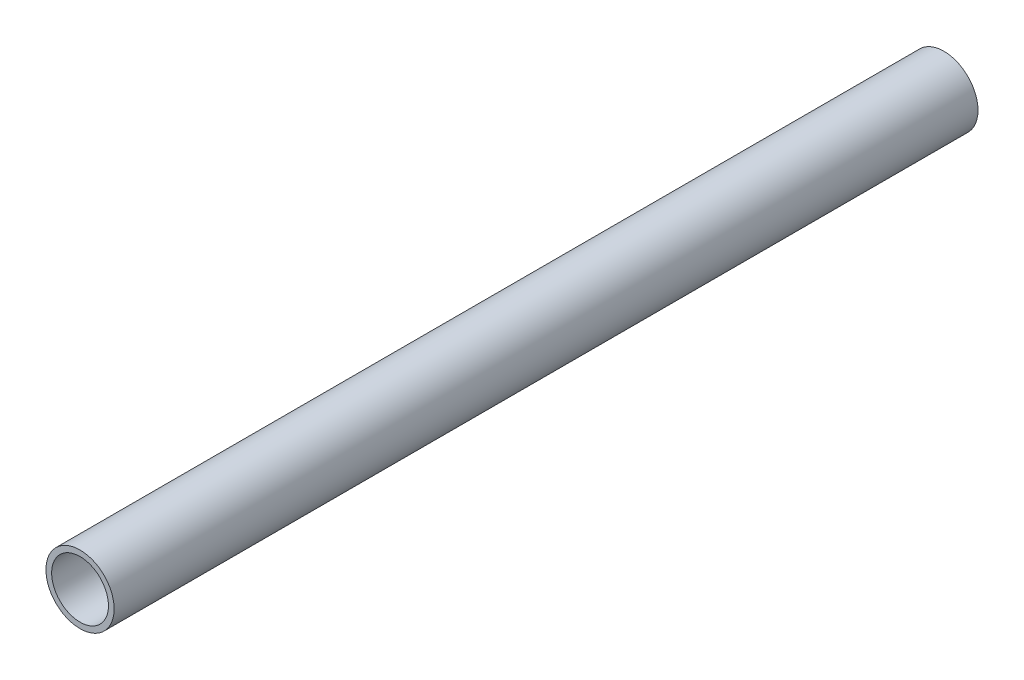
ISO-10303-21;
HEADER;
FILE_DESCRIPTION(('STEP AP214'),'2;1');
FILE_NAME('part.step','',(''),(''),'','','');
FILE_SCHEMA(('AUTOMOTIVE_DESIGN { 1 0 10303 214 1 1 1 1 }'));
ENDSEC;
DATA;
#1=APPLICATION_CONTEXT('core data for automotive mechanical design processes');
#2=APPLICATION_PROTOCOL_DEFINITION('international standard','automotive_design',2000,#1);
#3=PRODUCT_CONTEXT('',#1,'mechanical');
#4=PRODUCT('Part','Part','',(#3));
#5=PRODUCT_RELATED_PRODUCT_CATEGORY('part','',(#4));
#6=PRODUCT_DEFINITION_FORMATION('','',#4);
#7=PRODUCT_DEFINITION_CONTEXT('part definition',#1,'design');
#8=PRODUCT_DEFINITION('design','',#6,#7);
#9=PRODUCT_DEFINITION_SHAPE('','',#8);
#10=(LENGTH_UNIT() NAMED_UNIT(*) SI_UNIT(.MILLI.,.METRE.));
#11=(NAMED_UNIT(*) PLANE_ANGLE_UNIT() SI_UNIT($,.RADIAN.));
#12=(NAMED_UNIT(*) SI_UNIT($,.STERADIAN.) SOLID_ANGLE_UNIT());
#13=UNCERTAINTY_MEASURE_WITH_UNIT(LENGTH_MEASURE(1.E-05),#10,'distance_accuracy_value','');
#14=(GEOMETRIC_REPRESENTATION_CONTEXT(3) GLOBAL_UNCERTAINTY_ASSIGNED_CONTEXT((#13)) GLOBAL_UNIT_ASSIGNED_CONTEXT((#10,
#11,#12)) REPRESENTATION_CONTEXT('',''));
#15=CARTESIAN_POINT('',(0.,0.,0.));
#16=DIRECTION('',(0.,0.,1.));
#17=DIRECTION('',(1.,0.,0.));
#18=AXIS2_PLACEMENT_3D('',#15,#16,#17);
#19=CARTESIAN_POINT('',(0.,0.,37.9984));
#20=DIRECTION('',(0.,0.,1.));
#21=DIRECTION('',(1.,0.,0.));
#22=AXIS2_PLACEMENT_3D('',#19,#20,#21);
#23=PLANE('',#22);
#24=CARTESIAN_POINT('',(0.,0.,37.9984));
#25=DIRECTION('',(0.,0.,1.));
#26=DIRECTION('',(1.,0.,0.));
#27=AXIS2_PLACEMENT_3D('',#24,#25,#26);
#28=CIRCLE('',#27,1.5);
#29=CARTESIAN_POINT('',(1.5,0.,37.9984));
#30=VERTEX_POINT('',#29);
#31=EDGE_CURVE('E10',#30,#30,#28,.T.);
#32=ORIENTED_EDGE('',*,*,#31,.T.);
#33=EDGE_LOOP('',(#32));
#34=FACE_BOUND('',#33,.T.);
#35=CARTESIAN_POINT('',(0.,0.,37.9984));
#36=DIRECTION('',(0.,0.,1.));
#37=DIRECTION('',(1.,0.,0.));
#38=AXIS2_PLACEMENT_3D('',#35,#36,#37);
#39=CIRCLE('',#38,1.25);
#40=CARTESIAN_POINT('',(1.25,0.,37.9984));
#41=VERTEX_POINT('',#40);
#42=EDGE_CURVE('E48',#41,#41,#39,.T.);
#43=ORIENTED_EDGE('',*,*,#42,.F.);
#44=EDGE_LOOP('',(#43));
#45=FACE_BOUND('',#44,.T.);
#46=ADVANCED_FACE('F37',(#34,#45),#23,.T.);
#47=CARTESIAN_POINT('',(0.,0.,0.));
#48=DIRECTION('',(0.,0.,1.));
#49=DIRECTION('',(1.,0.,0.));
#50=AXIS2_PLACEMENT_3D('',#47,#48,#49);
#51=PLANE('',#50);
#52=CARTESIAN_POINT('',(0.,0.,0.));
#53=DIRECTION('',(0.,0.,1.));
#54=DIRECTION('',(1.,0.,0.));
#55=AXIS2_PLACEMENT_3D('',#52,#53,#54);
#56=CIRCLE('',#55,1.5);
#57=CARTESIAN_POINT('',(1.5,0.,0.));
#58=VERTEX_POINT('',#57);
#59=EDGE_CURVE('E41',#58,#58,#56,.T.);
#60=ORIENTED_EDGE('',*,*,#59,.F.);
#61=EDGE_LOOP('',(#60));
#62=FACE_BOUND('',#61,.T.);
#63=CARTESIAN_POINT('',(0.,0.,0.));
#64=DIRECTION('',(0.,0.,1.));
#65=DIRECTION('',(1.,0.,0.));
#66=AXIS2_PLACEMENT_3D('',#63,#64,#65);
#67=CIRCLE('',#66,1.25);
#68=CARTESIAN_POINT('',(1.25,0.,0.));
#69=VERTEX_POINT('',#68);
#70=EDGE_CURVE('E50',#69,#69,#67,.T.);
#71=ORIENTED_EDGE('',*,*,#70,.T.);
#72=EDGE_LOOP('',(#71));
#73=FACE_BOUND('',#72,.T.);
#74=ADVANCED_FACE('F60',(#62,#73),#51,.F.);
#75=CARTESIAN_POINT('',(0.,0.,37.9984));
#76=DIRECTION('',(0.,0.,-1.));
#77=DIRECTION('',(-1.,0.,0.));
#78=AXIS2_PLACEMENT_3D('',#75,#76,#77);
#79=CYLINDRICAL_SURFACE('',#78,1.5);
#80=ORIENTED_EDGE('',*,*,#31,.F.);
#81=EDGE_LOOP('',(#80));
#82=FACE_BOUND('',#81,.T.);
#83=ORIENTED_EDGE('',*,*,#59,.T.);
#84=EDGE_LOOP('',(#83));
#85=FACE_BOUND('',#84,.T.);
#86=ADVANCED_FACE('F39',(#82,#85),#79,.T.);
#87=CARTESIAN_POINT('',(0.,0.,37.9984));
#88=DIRECTION('',(0.,0.,-1.));
#89=DIRECTION('',(-1.,0.,0.));
#90=AXIS2_PLACEMENT_3D('',#87,#88,#89);
#91=CYLINDRICAL_SURFACE('',#90,1.25);
#92=ORIENTED_EDGE('',*,*,#42,.T.);
#93=EDGE_LOOP('',(#92));
#94=FACE_BOUND('',#93,.T.);
#95=ORIENTED_EDGE('',*,*,#70,.F.);
#96=EDGE_LOOP('',(#95));
#97=FACE_BOUND('',#96,.T.);
#98=ADVANCED_FACE('F56',(#94,#97),#91,.F.);
#99=CLOSED_SHELL('',(#46,#74,#86,#98));
#100=MANIFOLD_SOLID_BREP('B2',#99);
#101=ADVANCED_BREP_SHAPE_REPRESENTATION('',(#18,#100),#14);
#102=SHAPE_DEFINITION_REPRESENTATION(#9,#101);
ENDSEC;
END-ISO-10303-21;
